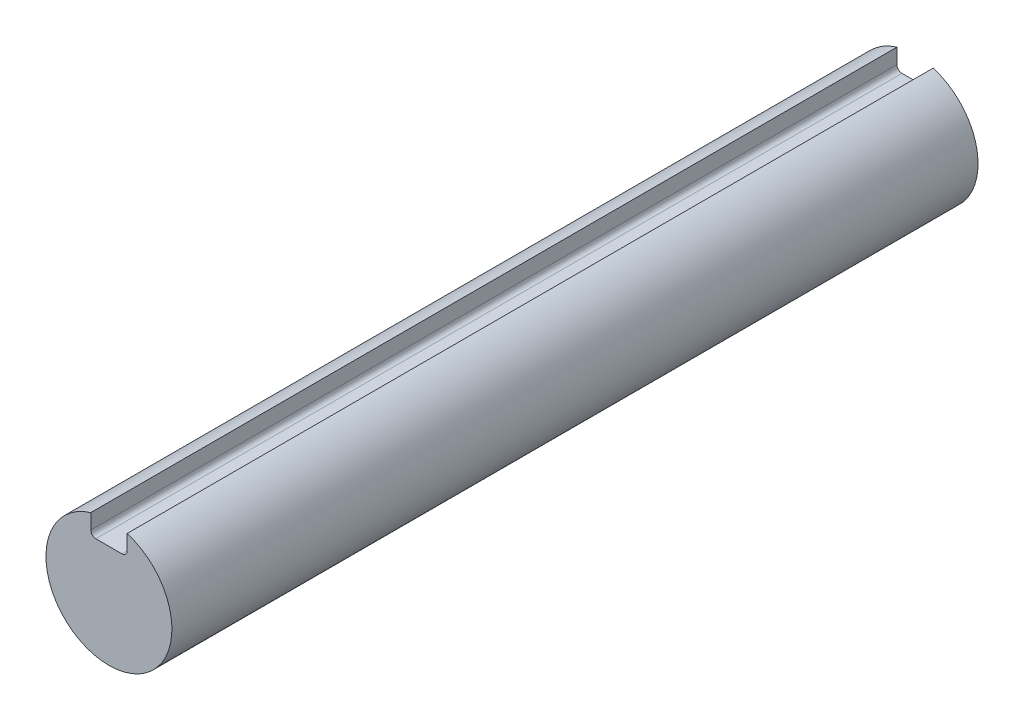
ISO-10303-21;
HEADER;
FILE_DESCRIPTION(('STEP AP214'),'2;1');
FILE_NAME('part.step','',(''),(''),'','','');
FILE_SCHEMA(('AUTOMOTIVE_DESIGN { 1 0 10303 214 1 1 1 1 }'));
ENDSEC;
DATA;
#1=APPLICATION_CONTEXT('core data for automotive mechanical design processes');
#2=APPLICATION_PROTOCOL_DEFINITION('international standard','automotive_design',2000,#1);
#3=PRODUCT_CONTEXT('',#1,'mechanical');
#4=PRODUCT('Part','Part','',(#3));
#5=PRODUCT_RELATED_PRODUCT_CATEGORY('part','',(#4));
#6=PRODUCT_DEFINITION_FORMATION('','',#4);
#7=PRODUCT_DEFINITION_CONTEXT('part definition',#1,'design');
#8=PRODUCT_DEFINITION('design','',#6,#7);
#9=PRODUCT_DEFINITION_SHAPE('','',#8);
#10=(LENGTH_UNIT() NAMED_UNIT(*) SI_UNIT(.MILLI.,.METRE.));
#11=(NAMED_UNIT(*) PLANE_ANGLE_UNIT() SI_UNIT($,.RADIAN.));
#12=(NAMED_UNIT(*) SI_UNIT($,.STERADIAN.) SOLID_ANGLE_UNIT());
#13=UNCERTAINTY_MEASURE_WITH_UNIT(LENGTH_MEASURE(1.E-05),#10,'distance_accuracy_value','');
#14=(GEOMETRIC_REPRESENTATION_CONTEXT(3) GLOBAL_UNCERTAINTY_ASSIGNED_CONTEXT((#13)) GLOBAL_UNIT_ASSIGNED_CONTEXT((#10,
#11,#12)) REPRESENTATION_CONTEXT('',''));
#15=CARTESIAN_POINT('',(0.,0.,0.));
#16=DIRECTION('',(0.,0.,1.));
#17=DIRECTION('',(1.,0.,0.));
#18=AXIS2_PLACEMENT_3D('',#15,#16,#17);
#19=CARTESIAN_POINT('',(0.,0.,-200.66));
#20=DIRECTION('',(0.,0.,-1.));
#21=DIRECTION('',(-1.,0.,0.));
#22=AXIS2_PLACEMENT_3D('',#19,#20,#21);
#23=CYLINDRICAL_SURFACE('',#22,7.9375);
#24=CARTESIAN_POINT('',(0.,0.,-302.26));
#25=DIRECTION('',(0.,0.,-1.));
#26=DIRECTION('',(-1.,0.,0.));
#27=AXIS2_PLACEMENT_3D('',#24,#25,#26);
#28=CIRCLE('',#27,7.9375);
#29=CARTESIAN_POINT('',(2.286,7.60119137043661,-302.26));
#30=VERTEX_POINT('',#29);
#31=CARTESIAN_POINT('',(-2.286,7.60119137043661,-302.26));
#32=VERTEX_POINT('',#31);
#33=EDGE_CURVE('E117',#30,#32,#28,.T.);
#34=ORIENTED_EDGE('',*,*,#33,.F.);
#35=DIRECTION('',(0.,0.,-1.));
#36=VECTOR('',#35,1.);
#37=CARTESIAN_POINT('',(2.286,7.60119137043661,-200.66));
#38=LINE('',#37,#36);
#39=CARTESIAN_POINT('',(2.286,7.60119137043661,-200.66));
#40=VERTEX_POINT('',#39);
#41=EDGE_CURVE('E11',#40,#30,#38,.T.);
#42=ORIENTED_EDGE('',*,*,#41,.F.);
#43=CARTESIAN_POINT('',(0.,0.,-200.66));
#44=DIRECTION('',(0.,0.,-1.));
#45=DIRECTION('',(-1.,0.,0.));
#46=AXIS2_PLACEMENT_3D('',#43,#44,#45);
#47=CIRCLE('',#46,7.9375);
#48=CARTESIAN_POINT('',(-2.286,7.60119137043661,-200.66));
#49=VERTEX_POINT('',#48);
#50=EDGE_CURVE('E131',#40,#49,#47,.T.);
#51=ORIENTED_EDGE('',*,*,#50,.T.);
#52=DIRECTION('',(0.,0.,-1.));
#53=VECTOR('',#52,1.);
#54=CARTESIAN_POINT('',(-2.286,7.60119137043661,-200.66));
#55=LINE('',#54,#53);
#56=EDGE_CURVE('E35',#49,#32,#55,.T.);
#57=ORIENTED_EDGE('',*,*,#56,.T.);
#58=EDGE_LOOP('',(#34,#42,#51,#57));
#59=FACE_BOUND('',#58,.T.);
#60=ADVANCED_FACE('F32',(#59),#23,.T.);
#61=CARTESIAN_POINT('',(2.286,5.69619137043661,-200.66));
#62=DIRECTION('',(-1.,0.,0.));
#63=DIRECTION('',(0.,-1.,0.));
#64=AXIS2_PLACEMENT_3D('',#61,#62,#63);
#65=PLANE('',#64);
#66=DIRECTION('',(0.,1.,0.));
#67=VECTOR('',#66,1.);
#68=CARTESIAN_POINT('',(2.286,5.69619137043661,-302.26));
#69=LINE('',#68,#67);
#70=CARTESIAN_POINT('',(2.286,5.69619137043661,-302.26));
#71=VERTEX_POINT('',#70);
#72=EDGE_CURVE('E129',#71,#30,#69,.T.);
#73=ORIENTED_EDGE('',*,*,#72,.F.);
#74=DIRECTION('',(0.,0.,-1.));
#75=VECTOR('',#74,1.);
#76=CARTESIAN_POINT('',(2.286,5.69619137043661,-200.66));
#77=LINE('',#76,#75);
#78=CARTESIAN_POINT('',(2.286,5.69619137043661,-200.66));
#79=VERTEX_POINT('',#78);
#80=EDGE_CURVE('E41',#79,#71,#77,.T.);
#81=ORIENTED_EDGE('',*,*,#80,.F.);
#82=DIRECTION('',(0.,1.,0.));
#83=VECTOR('',#82,1.);
#84=CARTESIAN_POINT('',(2.286,5.69619137043661,-200.66));
#85=LINE('',#84,#83);
#86=EDGE_CURVE('E107',#79,#40,#85,.T.);
#87=ORIENTED_EDGE('',*,*,#86,.T.);
#88=ORIENTED_EDGE('',*,*,#41,.T.);
#89=EDGE_LOOP('',(#73,#81,#87,#88));
#90=FACE_BOUND('',#89,.T.);
#91=ADVANCED_FACE('F139',(#90),#65,.T.);
#92=CARTESIAN_POINT('',(1.651,5.69619137043661,-200.66));
#93=DIRECTION('',(0.,0.,-1.));
#94=DIRECTION('',(-1.,0.,0.));
#95=AXIS2_PLACEMENT_3D('',#92,#93,#94);
#96=CYLINDRICAL_SURFACE('',#95,0.635);
#97=CARTESIAN_POINT('',(1.651,5.69619137043661,-302.26));
#98=DIRECTION('',(0.,0.,1.));
#99=DIRECTION('',(1.,0.,0.));
#100=AXIS2_PLACEMENT_3D('',#97,#98,#99);
#101=CIRCLE('',#100,0.635);
#102=CARTESIAN_POINT('',(1.651,5.06119137043661,-302.26));
#103=VERTEX_POINT('',#102);
#104=EDGE_CURVE('E94',#103,#71,#101,.T.);
#105=ORIENTED_EDGE('',*,*,#104,.F.);
#106=DIRECTION('',(0.,0.,-1.));
#107=VECTOR('',#106,1.);
#108=CARTESIAN_POINT('',(1.651,5.06119137043661,-200.66));
#109=LINE('',#108,#107);
#110=CARTESIAN_POINT('',(1.651,5.06119137043661,-200.66));
#111=VERTEX_POINT('',#110);
#112=EDGE_CURVE('E89',#111,#103,#109,.T.);
#113=ORIENTED_EDGE('',*,*,#112,.F.);
#114=CARTESIAN_POINT('',(1.651,5.69619137043661,-200.66));
#115=DIRECTION('',(0.,0.,1.));
#116=DIRECTION('',(1.,0.,0.));
#117=AXIS2_PLACEMENT_3D('',#114,#115,#116);
#118=CIRCLE('',#117,0.635);
#119=EDGE_CURVE('E92',#111,#79,#118,.T.);
#120=ORIENTED_EDGE('',*,*,#119,.T.);
#121=ORIENTED_EDGE('',*,*,#80,.T.);
#122=EDGE_LOOP('',(#105,#113,#120,#121));
#123=FACE_BOUND('',#122,.T.);
#124=ADVANCED_FACE('F91',(#123),#96,.F.);
#125=CARTESIAN_POINT('',(-1.651,5.06119137043661,-200.66));
#126=DIRECTION('',(0.,1.,0.));
#127=DIRECTION('',(0.,0.,1.));
#128=AXIS2_PLACEMENT_3D('',#125,#126,#127);
#129=PLANE('',#128);
#130=DIRECTION('',(1.,0.,0.));
#131=VECTOR('',#130,1.);
#132=CARTESIAN_POINT('',(-1.651,5.06119137043661,-302.26));
#133=LINE('',#132,#131);
#134=CARTESIAN_POINT('',(-1.651,5.06119137043661,-302.26));
#135=VERTEX_POINT('',#134);
#136=EDGE_CURVE('E126',#135,#103,#133,.T.);
#137=ORIENTED_EDGE('',*,*,#136,.F.);
#138=DIRECTION('',(0.,0.,-1.));
#139=VECTOR('',#138,1.);
#140=CARTESIAN_POINT('',(-1.651,5.06119137043661,-200.66));
#141=LINE('',#140,#139);
#142=CARTESIAN_POINT('',(-1.651,5.06119137043661,-200.66));
#143=VERTEX_POINT('',#142);
#144=EDGE_CURVE('E99',#143,#135,#141,.T.);
#145=ORIENTED_EDGE('',*,*,#144,.F.);
#146=DIRECTION('',(1.,0.,0.));
#147=VECTOR('',#146,1.);
#148=CARTESIAN_POINT('',(-1.651,5.06119137043661,-200.66));
#149=LINE('',#148,#147);
#150=EDGE_CURVE('E105',#143,#111,#149,.T.);
#151=ORIENTED_EDGE('',*,*,#150,.T.);
#152=ORIENTED_EDGE('',*,*,#112,.T.);
#153=EDGE_LOOP('',(#137,#145,#151,#152));
#154=FACE_BOUND('',#153,.T.);
#155=ADVANCED_FACE('F109',(#154),#129,.T.);
#156=CARTESIAN_POINT('',(-1.651,5.69619137043661,-200.66));
#157=DIRECTION('',(0.,0.,-1.));
#158=DIRECTION('',(-1.,0.,0.));
#159=AXIS2_PLACEMENT_3D('',#156,#157,#158);
#160=CYLINDRICAL_SURFACE('',#159,0.634999999999999);
#161=CARTESIAN_POINT('',(-1.651,5.69619137043661,-302.26));
#162=DIRECTION('',(0.,0.,1.));
#163=DIRECTION('',(1.,0.,0.));
#164=AXIS2_PLACEMENT_3D('',#161,#162,#163);
#165=CIRCLE('',#164,0.634999999999999);
#166=CARTESIAN_POINT('',(-2.286,5.69619137043661,-302.26));
#167=VERTEX_POINT('',#166);
#168=EDGE_CURVE('E123',#167,#135,#165,.T.);
#169=ORIENTED_EDGE('',*,*,#168,.F.);
#170=DIRECTION('',(0.,0.,-1.));
#171=VECTOR('',#170,1.);
#172=CARTESIAN_POINT('',(-2.286,5.69619137043661,-200.66));
#173=LINE('',#172,#171);
#174=CARTESIAN_POINT('',(-2.286,5.69619137043661,-200.66));
#175=VERTEX_POINT('',#174);
#176=EDGE_CURVE('E134',#175,#167,#173,.T.);
#177=ORIENTED_EDGE('',*,*,#176,.F.);
#178=CARTESIAN_POINT('',(-1.651,5.69619137043661,-200.66));
#179=DIRECTION('',(0.,0.,1.));
#180=DIRECTION('',(1.,0.,0.));
#181=AXIS2_PLACEMENT_3D('',#178,#179,#180);
#182=CIRCLE('',#181,0.634999999999999);
#183=EDGE_CURVE('E110',#175,#143,#182,.T.);
#184=ORIENTED_EDGE('',*,*,#183,.T.);
#185=ORIENTED_EDGE('',*,*,#144,.T.);
#186=EDGE_LOOP('',(#169,#177,#184,#185));
#187=FACE_BOUND('',#186,.T.);
#188=ADVANCED_FACE('F152',(#187),#160,.F.);
#189=CARTESIAN_POINT('',(-2.286,7.60119137043661,-200.66));
#190=DIRECTION('',(1.,0.,0.));
#191=DIRECTION('',(0.,0.,-1.));
#192=AXIS2_PLACEMENT_3D('',#189,#190,#191);
#193=PLANE('',#192);
#194=DIRECTION('',(0.,-1.,0.));
#195=VECTOR('',#194,1.);
#196=CARTESIAN_POINT('',(-2.286,7.60119137043661,-302.26));
#197=LINE('',#196,#195);
#198=EDGE_CURVE('E120',#32,#167,#197,.T.);
#199=ORIENTED_EDGE('',*,*,#198,.F.);
#200=ORIENTED_EDGE('',*,*,#56,.F.);
#201=DIRECTION('',(0.,-1.,0.));
#202=VECTOR('',#201,1.);
#203=CARTESIAN_POINT('',(-2.286,7.60119137043661,-200.66));
#204=LINE('',#203,#202);
#205=EDGE_CURVE('E112',#49,#175,#204,.T.);
#206=ORIENTED_EDGE('',*,*,#205,.T.);
#207=ORIENTED_EDGE('',*,*,#176,.T.);
#208=EDGE_LOOP('',(#199,#200,#206,#207));
#209=FACE_BOUND('',#208,.T.);
#210=ADVANCED_FACE('F136',(#209),#193,.T.);
#211=CARTESIAN_POINT('',(0.,0.,-200.66));
#212=DIRECTION('',(0.,0.,-1.));
#213=DIRECTION('',(-1.,0.,0.));
#214=AXIS2_PLACEMENT_3D('',#211,#212,#213);
#215=PLANE('',#214);
#216=ORIENTED_EDGE('',*,*,#50,.F.);
#217=ORIENTED_EDGE('',*,*,#86,.F.);
#218=ORIENTED_EDGE('',*,*,#119,.F.);
#219=ORIENTED_EDGE('',*,*,#150,.F.);
#220=ORIENTED_EDGE('',*,*,#183,.F.);
#221=ORIENTED_EDGE('',*,*,#205,.F.);
#222=EDGE_LOOP('',(#216,#217,#218,#219,#220,#221));
#223=FACE_BOUND('',#222,.T.);
#224=ADVANCED_FACE('F103',(#223),#215,.F.);
#225=CARTESIAN_POINT('',(0.,0.,-302.26));
#226=DIRECTION('',(0.,0.,-1.));
#227=DIRECTION('',(-1.,0.,0.));
#228=AXIS2_PLACEMENT_3D('',#225,#226,#227);
#229=PLANE('',#228);
#230=ORIENTED_EDGE('',*,*,#33,.T.);
#231=ORIENTED_EDGE('',*,*,#198,.T.);
#232=ORIENTED_EDGE('',*,*,#168,.T.);
#233=ORIENTED_EDGE('',*,*,#136,.T.);
#234=ORIENTED_EDGE('',*,*,#104,.T.);
#235=ORIENTED_EDGE('',*,*,#72,.T.);
#236=EDGE_LOOP('',(#230,#231,#232,#233,#234,#235));
#237=FACE_BOUND('',#236,.T.);
#238=ADVANCED_FACE('F138',(#237),#229,.T.);
#239=CLOSED_SHELL('',(#60,#91,#124,#155,#188,#210,#224,#238));
#240=MANIFOLD_SOLID_BREP('B2',#239);
#241=ADVANCED_BREP_SHAPE_REPRESENTATION('',(#18,#240),#14);
#242=SHAPE_DEFINITION_REPRESENTATION(#9,#241);
ENDSEC;
END-ISO-10303-21;
